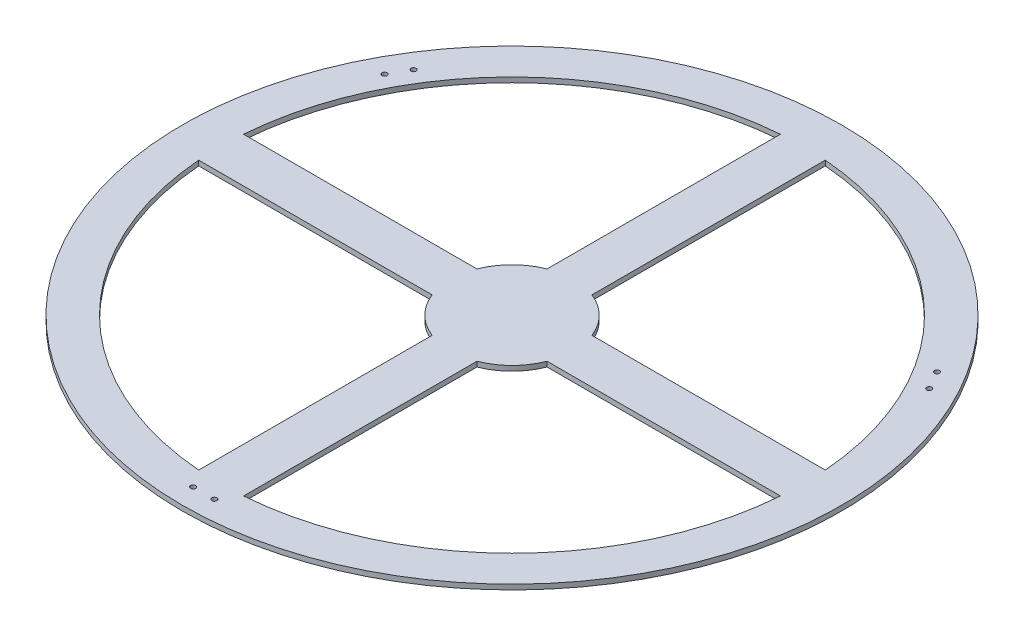
ISO-10303-21;
HEADER;
FILE_DESCRIPTION(('STEP AP214'),'2;1');
FILE_NAME('part.step','',(''),(''),'','','');
FILE_SCHEMA(('AUTOMOTIVE_DESIGN { 1 0 10303 214 1 1 1 1 }'));
ENDSEC;
DATA;
#1=APPLICATION_CONTEXT('core data for automotive mechanical design processes');
#2=APPLICATION_PROTOCOL_DEFINITION('international standard','automotive_design',2000,#1);
#3=PRODUCT_CONTEXT('',#1,'mechanical');
#4=PRODUCT('Part','Part','',(#3));
#5=PRODUCT_RELATED_PRODUCT_CATEGORY('part','',(#4));
#6=PRODUCT_DEFINITION_FORMATION('','',#4);
#7=PRODUCT_DEFINITION_CONTEXT('part definition',#1,'design');
#8=PRODUCT_DEFINITION('design','',#6,#7);
#9=PRODUCT_DEFINITION_SHAPE('','',#8);
#10=(LENGTH_UNIT() NAMED_UNIT(*) SI_UNIT(.MILLI.,.METRE.));
#11=(NAMED_UNIT(*) PLANE_ANGLE_UNIT() SI_UNIT($,.RADIAN.));
#12=(NAMED_UNIT(*) SI_UNIT($,.STERADIAN.) SOLID_ANGLE_UNIT());
#13=UNCERTAINTY_MEASURE_WITH_UNIT(LENGTH_MEASURE(1.E-05),#10,'distance_accuracy_value','');
#14=(GEOMETRIC_REPRESENTATION_CONTEXT(3) GLOBAL_UNCERTAINTY_ASSIGNED_CONTEXT((#13)) GLOBAL_UNIT_ASSIGNED_CONTEXT((#10,
#11,#12)) REPRESENTATION_CONTEXT('',''));
#15=CARTESIAN_POINT('',(0.,0.,0.));
#16=DIRECTION('',(0.,0.,1.));
#17=DIRECTION('',(1.,0.,0.));
#18=AXIS2_PLACEMENT_3D('',#15,#16,#17);
#19=CARTESIAN_POINT('',(479.721156758054,3.,-531.943650224748));
#20=DIRECTION('',(0.,1.,0.));
#21=DIRECTION('',(0.,0.,1.));
#22=AXIS2_PLACEMENT_3D('',#19,#20,#21);
#23=PLANE('',#22);
#24=CARTESIAN_POINT('',(642.374734864959,3.,-618.519388910717));
#25=DIRECTION('',(0.,1.,0.));
#26=DIRECTION('',(0.,0.,1.));
#27=AXIS2_PLACEMENT_3D('',#24,#25,#26);
#28=CIRCLE('',#27,1.50000000000008);
#29=CARTESIAN_POINT('',(642.374734864959,3.,-617.019388910717));
#30=VERTEX_POINT('',#29);
#31=EDGE_CURVE('E327',#30,#30,#28,.T.);
#32=ORIENTED_EDGE('',*,*,#31,.F.);
#33=EDGE_LOOP('',(#32));
#34=FACE_BOUND('',#33,.T.);
#35=DIRECTION('',(0.,0.,-1.));
#36=VECTOR('',#35,1.);
#37=CARTESIAN_POINT('',(466.318275115398,3.,-566.278317303318));
#38=LINE('',#37,#36);
#39=CARTESIAN_POINT('',(466.318275115398,3.,-566.278317303318));
#40=VERTEX_POINT('',#39);
#41=CARTESIAN_POINT('',(466.318275115398,3.,-705.664851299757));
#42=VERTEX_POINT('',#41);
#43=EDGE_CURVE('E160',#40,#42,#38,.T.);
#44=ORIENTED_EDGE('',*,*,#43,.F.);
#45=CARTESIAN_POINT('',(479.721156758054,3.,-531.943650224748));
#46=DIRECTION('',(0.,-1.,0.));
#47=DIRECTION('',(0.,0.,1.));
#48=AXIS2_PLACEMENT_3D('',#45,#46,#47);
#49=CIRCLE('',#48,36.8579245173041);
#50=CARTESIAN_POINT('',(445.386489679484,3.,-545.346531867404));
#51=VERTEX_POINT('',#50);
#52=EDGE_CURVE('E152',#51,#40,#49,.T.);
#53=ORIENTED_EDGE('',*,*,#52,.F.);
#54=DIRECTION('',(1.,0.,0.));
#55=VECTOR('',#54,1.);
#56=CARTESIAN_POINT('',(445.386489679484,3.,-545.346531867404));
#57=LINE('',#56,#55);
#58=CARTESIAN_POINT('',(305.999955683046,3.,-545.346531867404));
#59=VERTEX_POINT('',#58);
#60=EDGE_CURVE('E175',#59,#51,#57,.T.);
#61=ORIENTED_EDGE('',*,*,#60,.F.);
#62=CARTESIAN_POINT('',(479.721156758054,3.,-531.943650224748));
#63=DIRECTION('',(0.,1.,0.));
#64=DIRECTION('',(0.,0.,1.));
#65=AXIS2_PLACEMENT_3D('',#62,#63,#64);
#66=CIRCLE('',#65,174.237461354528);
#67=EDGE_CURVE('E173',#42,#59,#66,.T.);
#68=ORIENTED_EDGE('',*,*,#67,.F.);
#69=EDGE_LOOP('',(#44,#53,#61,#68));
#70=FACE_BOUND('',#69,.T.);
#71=DIRECTION('',(1.,0.,0.));
#72=VECTOR('',#71,1.);
#73=CARTESIAN_POINT('',(653.442357833063,3.,-545.346531867405));
#74=LINE('',#73,#72);
#75=CARTESIAN_POINT('',(514.055823836624,3.,-545.346531867405));
#76=VERTEX_POINT('',#75);
#77=CARTESIAN_POINT('',(653.442357833063,3.,-545.346531867405));
#78=VERTEX_POINT('',#77);
#79=EDGE_CURVE('E193',#76,#78,#74,.T.);
#80=ORIENTED_EDGE('',*,*,#79,.F.);
#81=CARTESIAN_POINT('',(479.721156758054,3.,-531.943650224748));
#82=DIRECTION('',(0.,-1.,0.));
#83=DIRECTION('',(0.,0.,1.));
#84=AXIS2_PLACEMENT_3D('',#81,#82,#83);
#85=CIRCLE('',#84,36.857924517304);
#86=CARTESIAN_POINT('',(493.12403840071,3.,-566.278317303318));
#87=VERTEX_POINT('',#86);
#88=EDGE_CURVE('E191',#87,#76,#85,.T.);
#89=ORIENTED_EDGE('',*,*,#88,.F.);
#90=DIRECTION('',(0.,0.,1.));
#91=VECTOR('',#90,1.);
#92=CARTESIAN_POINT('',(493.12403840071,3.,-566.278317303318));
#93=LINE('',#92,#91);
#94=CARTESIAN_POINT('',(493.12403840071,3.,-705.664851299757));
#95=VERTEX_POINT('',#94);
#96=EDGE_CURVE('E199',#95,#87,#93,.T.);
#97=ORIENTED_EDGE('',*,*,#96,.F.);
#98=CARTESIAN_POINT('',(479.721156758054,3.,-531.943650224748));
#99=DIRECTION('',(0.,1.,0.));
#100=DIRECTION('',(0.,0.,1.));
#101=AXIS2_PLACEMENT_3D('',#98,#99,#100);
#102=CIRCLE('',#101,174.237461354528);
#103=EDGE_CURVE('E196',#78,#95,#102,.T.);
#104=ORIENTED_EDGE('',*,*,#103,.F.);
#105=EDGE_LOOP('',(#80,#89,#97,#104));
#106=FACE_BOUND('',#105,.T.);
#107=CARTESIAN_POINT('',(323.41757865115,3.,-629.517911538779));
#108=DIRECTION('',(0.,1.,0.));
#109=DIRECTION('',(0.,0.,1.));
#110=AXIS2_PLACEMENT_3D('',#107,#108,#109);
#111=CIRCLE('',#110,1.50000000000008);
#112=CARTESIAN_POINT('',(323.41757865115,3.,-628.017911538779));
#113=VERTEX_POINT('',#112);
#114=EDGE_CURVE('E222',#113,#113,#111,.T.);
#115=ORIENTED_EDGE('',*,*,#114,.F.);
#116=EDGE_LOOP('',(#115));
#117=FACE_BOUND('',#116,.T.);
#118=CARTESIAN_POINT('',(473.371156758054,3.,-347.793650224748));
#119=DIRECTION('',(0.,1.,0.));
#120=DIRECTION('',(0.,0.,1.));
#121=AXIS2_PLACEMENT_3D('',#118,#119,#120);
#122=CIRCLE('',#121,1.50000000000002);
#123=CARTESIAN_POINT('',(473.371156758054,3.,-346.293650224748));
#124=VERTEX_POINT('',#123);
#125=EDGE_CURVE('E296',#124,#124,#122,.T.);
#126=ORIENTED_EDGE('',*,*,#125,.F.);
#127=EDGE_LOOP('',(#126));
#128=FACE_BOUND('',#127,.T.);
#129=CARTESIAN_POINT('',(479.721156758054,3.,-531.943650224748));
#130=DIRECTION('',(0.,1.,0.));
#131=DIRECTION('',(0.,0.,1.));
#132=AXIS2_PLACEMENT_3D('',#129,#130,#131);
#133=CIRCLE('',#132,196.85);
#134=CARTESIAN_POINT('',(479.721156758054,3.,-335.093650224748));
#135=VERTEX_POINT('',#134);
#136=EDGE_CURVE('E11',#135,#135,#133,.T.);
#137=ORIENTED_EDGE('',*,*,#136,.T.);
#138=EDGE_LOOP('',(#137));
#139=FACE_BOUND('',#138,.T.);
#140=CARTESIAN_POINT('',(486.071156758054,3.,-347.793650224748));
#141=DIRECTION('',(0.,1.,0.));
#142=DIRECTION('',(0.,0.,1.));
#143=AXIS2_PLACEMENT_3D('',#140,#141,#142);
#144=CIRCLE('',#143,1.50000000000002);
#145=CARTESIAN_POINT('',(486.071156758054,3.,-346.293650224748));
#146=VERTEX_POINT('',#145);
#147=EDGE_CURVE('E290',#146,#146,#144,.T.);
#148=ORIENTED_EDGE('',*,*,#147,.F.);
#149=EDGE_LOOP('',(#148));
#150=FACE_BOUND('',#149,.T.);
#151=DIRECTION('',(0.,0.,1.));
#152=VECTOR('',#151,1.);
#153=CARTESIAN_POINT('',(493.12403840071,3.,-358.22244914974));
#154=LINE('',#153,#152);
#155=CARTESIAN_POINT('',(493.12403840071,3.,-497.608983146178));
#156=VERTEX_POINT('',#155);
#157=CARTESIAN_POINT('',(493.12403840071,3.,-358.22244914974));
#158=VERTEX_POINT('',#157);
#159=EDGE_CURVE('E261',#156,#158,#154,.T.);
#160=ORIENTED_EDGE('',*,*,#159,.F.);
#161=CARTESIAN_POINT('',(479.721156758054,3.,-531.943650224748));
#162=DIRECTION('',(0.,-1.,0.));
#163=DIRECTION('',(0.,0.,1.));
#164=AXIS2_PLACEMENT_3D('',#161,#162,#163);
#165=CIRCLE('',#164,36.8579245173039);
#166=CARTESIAN_POINT('',(514.055823836624,3.,-518.540768582092));
#167=VERTEX_POINT('',#166);
#168=EDGE_CURVE('E259',#167,#156,#165,.T.);
#169=ORIENTED_EDGE('',*,*,#168,.F.);
#170=DIRECTION('',(-1.,0.,0.));
#171=VECTOR('',#170,1.);
#172=CARTESIAN_POINT('',(653.442357833063,3.,-518.540768582092));
#173=LINE('',#172,#171);
#174=CARTESIAN_POINT('',(653.442357833063,3.,-518.540768582092));
#175=VERTEX_POINT('',#174);
#176=EDGE_CURVE('E267',#175,#167,#173,.T.);
#177=ORIENTED_EDGE('',*,*,#176,.F.);
#178=CARTESIAN_POINT('',(479.721156758054,3.,-531.943650224748));
#179=DIRECTION('',(0.,1.,0.));
#180=DIRECTION('',(0.,0.,1.));
#181=AXIS2_PLACEMENT_3D('',#178,#179,#180);
#182=CIRCLE('',#181,174.237461354528);
#183=EDGE_CURVE('E264',#158,#175,#182,.T.);
#184=ORIENTED_EDGE('',*,*,#183,.F.);
#185=EDGE_LOOP('',(#160,#169,#177,#184));
#186=FACE_BOUND('',#185,.T.);
#187=DIRECTION('',(-1.,0.,0.));
#188=VECTOR('',#187,1.);
#189=CARTESIAN_POINT('',(305.999955683046,3.,-518.540768582092));
#190=LINE('',#189,#188);
#191=CARTESIAN_POINT('',(445.386489679484,3.,-518.540768582092));
#192=VERTEX_POINT('',#191);
#193=CARTESIAN_POINT('',(305.999955683046,3.,-518.540768582092));
#194=VERTEX_POINT('',#193);
#195=EDGE_CURVE('E230',#192,#194,#190,.T.);
#196=ORIENTED_EDGE('',*,*,#195,.F.);
#197=CARTESIAN_POINT('',(479.721156758054,3.,-531.943650224748));
#198=DIRECTION('',(0.,-1.,0.));
#199=DIRECTION('',(0.,0.,1.));
#200=AXIS2_PLACEMENT_3D('',#197,#198,#199);
#201=CIRCLE('',#200,36.857924517304);
#202=CARTESIAN_POINT('',(466.318275115398,3.,-497.608983146178));
#203=VERTEX_POINT('',#202);
#204=EDGE_CURVE('E228',#203,#192,#201,.T.);
#205=ORIENTED_EDGE('',*,*,#204,.F.);
#206=DIRECTION('',(0.,0.,-1.));
#207=VECTOR('',#206,1.);
#208=CARTESIAN_POINT('',(466.318275115398,3.,-358.22244914974));
#209=LINE('',#208,#207);
#210=CARTESIAN_POINT('',(466.318275115398,3.,-358.22244914974));
#211=VERTEX_POINT('',#210);
#212=EDGE_CURVE('E236',#211,#203,#209,.T.);
#213=ORIENTED_EDGE('',*,*,#212,.F.);
#214=CARTESIAN_POINT('',(479.721156758054,3.,-531.943650224748));
#215=DIRECTION('',(0.,1.,0.));
#216=DIRECTION('',(0.,0.,1.));
#217=AXIS2_PLACEMENT_3D('',#214,#215,#216);
#218=CIRCLE('',#217,174.237461354528);
#219=EDGE_CURVE('E233',#194,#211,#218,.T.);
#220=ORIENTED_EDGE('',*,*,#219,.F.);
#221=EDGE_LOOP('',(#196,#205,#213,#220));
#222=FACE_BOUND('',#221,.T.);
#223=CARTESIAN_POINT('',(317.06757865115,3.,-618.519388910717));
#224=DIRECTION('',(0.,1.,0.));
#225=DIRECTION('',(0.,0.,1.));
#226=AXIS2_PLACEMENT_3D('',#223,#224,#225);
#227=CIRCLE('',#226,1.50000000000008);
#228=CARTESIAN_POINT('',(317.06757865115,3.,-617.019388910717));
#229=VERTEX_POINT('',#228);
#230=EDGE_CURVE('E181',#229,#229,#227,.T.);
#231=ORIENTED_EDGE('',*,*,#230,.F.);
#232=EDGE_LOOP('',(#231));
#233=FACE_BOUND('',#232,.T.);
#234=CARTESIAN_POINT('',(636.024734864959,3.,-629.51791153878));
#235=DIRECTION('',(0.,1.,0.));
#236=DIRECTION('',(0.,0.,1.));
#237=AXIS2_PLACEMENT_3D('',#234,#235,#236);
#238=CIRCLE('',#237,1.50000000000008);
#239=CARTESIAN_POINT('',(636.024734864959,3.,-628.017911538779));
#240=VERTEX_POINT('',#239);
#241=EDGE_CURVE('E334',#240,#240,#238,.T.);
#242=ORIENTED_EDGE('',*,*,#241,.F.);
#243=EDGE_LOOP('',(#242));
#244=FACE_BOUND('',#243,.T.);
#245=ADVANCED_FACE('F39',(#34,#70,#106,#117,#128,#139,#150,#186,#222,#233,#244),#23,.T.);
#246=CARTESIAN_POINT('',(479.721156758054,0.,-531.943650224748));
#247=DIRECTION('',(0.,1.,0.));
#248=DIRECTION('',(0.,0.,1.));
#249=AXIS2_PLACEMENT_3D('',#246,#247,#248);
#250=PLANE('',#249);
#251=CARTESIAN_POINT('',(479.721156758054,0.,-531.943650224748));
#252=DIRECTION('',(0.,-1.,0.));
#253=DIRECTION('',(0.,0.,1.));
#254=AXIS2_PLACEMENT_3D('',#251,#252,#253);
#255=CIRCLE('',#254,36.857924517304);
#256=CARTESIAN_POINT('',(493.12403840071,0.,-566.278317303318));
#257=VERTEX_POINT('',#256);
#258=CARTESIAN_POINT('',(514.055823836624,0.,-545.346531867405));
#259=VERTEX_POINT('',#258);
#260=EDGE_CURVE('E168',#257,#259,#255,.T.);
#261=ORIENTED_EDGE('',*,*,#260,.T.);
#262=DIRECTION('',(1.,0.,0.));
#263=VECTOR('',#262,1.);
#264=CARTESIAN_POINT('',(653.442357833063,0.,-545.346531867405));
#265=LINE('',#264,#263);
#266=CARTESIAN_POINT('',(653.442357833063,0.,-545.346531867405));
#267=VERTEX_POINT('',#266);
#268=EDGE_CURVE('E204',#259,#267,#265,.T.);
#269=ORIENTED_EDGE('',*,*,#268,.T.);
#270=CARTESIAN_POINT('',(479.721156758054,0.,-531.943650224748));
#271=DIRECTION('',(0.,1.,0.));
#272=DIRECTION('',(0.,0.,1.));
#273=AXIS2_PLACEMENT_3D('',#270,#271,#272);
#274=CIRCLE('',#273,174.237461354528);
#275=CARTESIAN_POINT('',(493.12403840071,0.,-705.664851299757));
#276=VERTEX_POINT('',#275);
#277=EDGE_CURVE('E207',#267,#276,#274,.T.);
#278=ORIENTED_EDGE('',*,*,#277,.T.);
#279=DIRECTION('',(0.,0.,1.));
#280=VECTOR('',#279,1.);
#281=CARTESIAN_POINT('',(493.12403840071,0.,-566.278317303318));
#282=LINE('',#281,#280);
#283=EDGE_CURVE('E194',#276,#257,#282,.T.);
#284=ORIENTED_EDGE('',*,*,#283,.T.);
#285=EDGE_LOOP('',(#261,#269,#278,#284));
#286=FACE_BOUND('',#285,.T.);
#287=CARTESIAN_POINT('',(479.721156758054,0.,-531.943650224748));
#288=DIRECTION('',(0.,-1.,0.));
#289=DIRECTION('',(0.,0.,1.));
#290=AXIS2_PLACEMENT_3D('',#287,#288,#289);
#291=CIRCLE('',#290,36.8579245173039);
#292=CARTESIAN_POINT('',(514.055823836624,0.,-518.540768582093));
#293=VERTEX_POINT('',#292);
#294=CARTESIAN_POINT('',(493.12403840071,0.,-497.608983146178));
#295=VERTEX_POINT('',#294);
#296=EDGE_CURVE('E258',#293,#295,#291,.T.);
#297=ORIENTED_EDGE('',*,*,#296,.T.);
#298=DIRECTION('',(0.,0.,1.));
#299=VECTOR('',#298,1.);
#300=CARTESIAN_POINT('',(493.12403840071,0.,-358.22244914974));
#301=LINE('',#300,#299);
#302=CARTESIAN_POINT('',(493.12403840071,0.,-358.22244914974));
#303=VERTEX_POINT('',#302);
#304=EDGE_CURVE('E272',#295,#303,#301,.T.);
#305=ORIENTED_EDGE('',*,*,#304,.T.);
#306=CARTESIAN_POINT('',(479.721156758054,0.,-531.943650224748));
#307=DIRECTION('',(0.,1.,0.));
#308=DIRECTION('',(0.,0.,1.));
#309=AXIS2_PLACEMENT_3D('',#306,#307,#308);
#310=CIRCLE('',#309,174.237461354528);
#311=CARTESIAN_POINT('',(653.442357833063,0.,-518.540768582092));
#312=VERTEX_POINT('',#311);
#313=EDGE_CURVE('E275',#303,#312,#310,.T.);
#314=ORIENTED_EDGE('',*,*,#313,.T.);
#315=DIRECTION('',(-1.,0.,0.));
#316=VECTOR('',#315,1.);
#317=CARTESIAN_POINT('',(653.442357833063,0.,-518.540768582092));
#318=LINE('',#317,#316);
#319=EDGE_CURVE('E262',#312,#293,#318,.T.);
#320=ORIENTED_EDGE('',*,*,#319,.T.);
#321=EDGE_LOOP('',(#297,#305,#314,#320));
#322=FACE_BOUND('',#321,.T.);
#323=CARTESIAN_POINT('',(479.721156758054,0.,-531.943650224748));
#324=DIRECTION('',(0.,1.,0.));
#325=DIRECTION('',(0.,0.,1.));
#326=AXIS2_PLACEMENT_3D('',#323,#324,#325);
#327=CIRCLE('',#326,196.85);
#328=CARTESIAN_POINT('',(479.721156758054,0.,-335.093650224748));
#329=VERTEX_POINT('',#328);
#330=EDGE_CURVE('E43',#329,#329,#327,.T.);
#331=ORIENTED_EDGE('',*,*,#330,.F.);
#332=EDGE_LOOP('',(#331));
#333=FACE_BOUND('',#332,.T.);
#334=CARTESIAN_POINT('',(473.371156758054,0.,-347.793650224748));
#335=DIRECTION('',(0.,1.,0.));
#336=DIRECTION('',(0.,0.,1.));
#337=AXIS2_PLACEMENT_3D('',#334,#335,#336);
#338=CIRCLE('',#337,1.50000000000002);
#339=CARTESIAN_POINT('',(473.371156758054,0.,-346.293650224748));
#340=VERTEX_POINT('',#339);
#341=EDGE_CURVE('E293',#340,#340,#338,.T.);
#342=ORIENTED_EDGE('',*,*,#341,.T.);
#343=EDGE_LOOP('',(#342));
#344=FACE_BOUND('',#343,.T.);
#345=CARTESIAN_POINT('',(486.071156758054,0.,-347.793650224748));
#346=DIRECTION('',(0.,1.,0.));
#347=DIRECTION('',(0.,0.,1.));
#348=AXIS2_PLACEMENT_3D('',#345,#346,#347);
#349=CIRCLE('',#348,1.50000000000002);
#350=CARTESIAN_POINT('',(486.071156758054,0.,-346.293650224748));
#351=VERTEX_POINT('',#350);
#352=EDGE_CURVE('E289',#351,#351,#349,.T.);
#353=ORIENTED_EDGE('',*,*,#352,.T.);
#354=EDGE_LOOP('',(#353));
#355=FACE_BOUND('',#354,.T.);
#356=CARTESIAN_POINT('',(479.721156758054,0.,-531.943650224748));
#357=DIRECTION('',(0.,-1.,0.));
#358=DIRECTION('',(0.,0.,1.));
#359=AXIS2_PLACEMENT_3D('',#356,#357,#358);
#360=CIRCLE('',#359,36.857924517304);
#361=CARTESIAN_POINT('',(466.318275115398,0.,-497.608983146178));
#362=VERTEX_POINT('',#361);
#363=CARTESIAN_POINT('',(445.386489679484,0.,-518.540768582092));
#364=VERTEX_POINT('',#363);
#365=EDGE_CURVE('E225',#362,#364,#360,.T.);
#366=ORIENTED_EDGE('',*,*,#365,.T.);
#367=DIRECTION('',(-1.,0.,0.));
#368=VECTOR('',#367,1.);
#369=CARTESIAN_POINT('',(305.999955683046,0.,-518.540768582092));
#370=LINE('',#369,#368);
#371=CARTESIAN_POINT('',(305.999955683046,0.,-518.540768582092));
#372=VERTEX_POINT('',#371);
#373=EDGE_CURVE('E241',#364,#372,#370,.T.);
#374=ORIENTED_EDGE('',*,*,#373,.T.);
#375=CARTESIAN_POINT('',(479.721156758054,0.,-531.943650224748));
#376=DIRECTION('',(0.,1.,0.));
#377=DIRECTION('',(0.,0.,1.));
#378=AXIS2_PLACEMENT_3D('',#375,#376,#377);
#379=CIRCLE('',#378,174.237461354528);
#380=CARTESIAN_POINT('',(466.318275115398,0.,-358.22244914974));
#381=VERTEX_POINT('',#380);
#382=EDGE_CURVE('E244',#372,#381,#379,.T.);
#383=ORIENTED_EDGE('',*,*,#382,.T.);
#384=DIRECTION('',(0.,0.,-1.));
#385=VECTOR('',#384,1.);
#386=CARTESIAN_POINT('',(466.318275115398,0.,-358.22244914974));
#387=LINE('',#386,#385);
#388=EDGE_CURVE('E231',#381,#362,#387,.T.);
#389=ORIENTED_EDGE('',*,*,#388,.T.);
#390=EDGE_LOOP('',(#366,#374,#383,#389));
#391=FACE_BOUND('',#390,.T.);
#392=CARTESIAN_POINT('',(323.41757865115,0.,-629.517911538779));
#393=DIRECTION('',(0.,1.,0.));
#394=DIRECTION('',(0.,0.,1.));
#395=AXIS2_PLACEMENT_3D('',#392,#393,#394);
#396=CIRCLE('',#395,1.50000000000008);
#397=CARTESIAN_POINT('',(323.41757865115,0.,-628.017911538779));
#398=VERTEX_POINT('',#397);
#399=EDGE_CURVE('E221',#398,#398,#396,.T.);
#400=ORIENTED_EDGE('',*,*,#399,.T.);
#401=EDGE_LOOP('',(#400));
#402=FACE_BOUND('',#401,.T.);
#403=CARTESIAN_POINT('',(479.721156758054,0.,-531.943650224748));
#404=DIRECTION('',(0.,-1.,0.));
#405=DIRECTION('',(0.,0.,1.));
#406=AXIS2_PLACEMENT_3D('',#403,#404,#405);
#407=CIRCLE('',#406,36.8579245173041);
#408=CARTESIAN_POINT('',(445.386489679484,0.,-545.346531867404));
#409=VERTEX_POINT('',#408);
#410=CARTESIAN_POINT('',(466.318275115398,0.,-566.278317303318));
#411=VERTEX_POINT('',#410);
#412=EDGE_CURVE('E62',#409,#411,#407,.T.);
#413=ORIENTED_EDGE('',*,*,#412,.T.);
#414=DIRECTION('',(0.,0.,-1.));
#415=VECTOR('',#414,1.);
#416=CARTESIAN_POINT('',(466.318275115398,0.,-566.278317303318));
#417=LINE('',#416,#415);
#418=CARTESIAN_POINT('',(466.318275115398,0.,-705.664851299757));
#419=VERTEX_POINT('',#418);
#420=EDGE_CURVE('E167',#411,#419,#417,.T.);
#421=ORIENTED_EDGE('',*,*,#420,.T.);
#422=CARTESIAN_POINT('',(479.721156758054,0.,-531.943650224748));
#423=DIRECTION('',(0.,1.,0.));
#424=DIRECTION('',(0.,0.,1.));
#425=AXIS2_PLACEMENT_3D('',#422,#423,#424);
#426=CIRCLE('',#425,174.237461354528);
#427=CARTESIAN_POINT('',(305.999955683046,0.,-545.346531867404));
#428=VERTEX_POINT('',#427);
#429=EDGE_CURVE('E183',#419,#428,#426,.T.);
#430=ORIENTED_EDGE('',*,*,#429,.T.);
#431=DIRECTION('',(1.,0.,0.));
#432=VECTOR('',#431,1.);
#433=CARTESIAN_POINT('',(445.386489679484,0.,-545.346531867404));
#434=LINE('',#433,#432);
#435=EDGE_CURVE('E161',#428,#409,#434,.T.);
#436=ORIENTED_EDGE('',*,*,#435,.T.);
#437=EDGE_LOOP('',(#413,#421,#430,#436));
#438=FACE_BOUND('',#437,.T.);
#439=CARTESIAN_POINT('',(317.06757865115,0.,-618.519388910717));
#440=DIRECTION('',(0.,1.,0.));
#441=DIRECTION('',(0.,0.,1.));
#442=AXIS2_PLACEMENT_3D('',#439,#440,#441);
#443=CIRCLE('',#442,1.50000000000008);
#444=CARTESIAN_POINT('',(317.06757865115,0.,-617.019388910717));
#445=VERTEX_POINT('',#444);
#446=EDGE_CURVE('E329',#445,#445,#443,.T.);
#447=ORIENTED_EDGE('',*,*,#446,.T.);
#448=EDGE_LOOP('',(#447));
#449=FACE_BOUND('',#448,.T.);
#450=CARTESIAN_POINT('',(642.374734864959,0.,-618.519388910717));
#451=DIRECTION('',(0.,1.,0.));
#452=DIRECTION('',(0.,0.,1.));
#453=AXIS2_PLACEMENT_3D('',#450,#451,#452);
#454=CIRCLE('',#453,1.50000000000008);
#455=CARTESIAN_POINT('',(642.374734864959,0.,-617.019388910717));
#456=VERTEX_POINT('',#455);
#457=EDGE_CURVE('E330',#456,#456,#454,.T.);
#458=ORIENTED_EDGE('',*,*,#457,.T.);
#459=EDGE_LOOP('',(#458));
#460=FACE_BOUND('',#459,.T.);
#461=CARTESIAN_POINT('',(636.024734864959,0.,-629.51791153878));
#462=DIRECTION('',(0.,1.,0.));
#463=DIRECTION('',(0.,0.,1.));
#464=AXIS2_PLACEMENT_3D('',#461,#462,#463);
#465=CIRCLE('',#464,1.50000000000008);
#466=CARTESIAN_POINT('',(636.024734864959,0.,-628.017911538779));
#467=VERTEX_POINT('',#466);
#468=EDGE_CURVE('E337',#467,#467,#465,.T.);
#469=ORIENTED_EDGE('',*,*,#468,.T.);
#470=EDGE_LOOP('',(#469));
#471=FACE_BOUND('',#470,.T.);
#472=ADVANCED_FACE('F302',(#286,#322,#333,#344,#355,#391,#402,#438,#449,#460,#471),#250,.F.);
#473=CARTESIAN_POINT('',(479.721156758054,3.,-531.943650224748));
#474=DIRECTION('',(0.,-1.,0.));
#475=DIRECTION('',(0.,0.,-1.));
#476=AXIS2_PLACEMENT_3D('',#473,#474,#475);
#477=CYLINDRICAL_SURFACE('',#476,196.85);
#478=ORIENTED_EDGE('',*,*,#136,.F.);
#479=EDGE_LOOP('',(#478));
#480=FACE_BOUND('',#479,.T.);
#481=ORIENTED_EDGE('',*,*,#330,.T.);
#482=EDGE_LOOP('',(#481));
#483=FACE_BOUND('',#482,.T.);
#484=ADVANCED_FACE('F41',(#480,#483),#477,.T.);
#485=CARTESIAN_POINT('',(473.371156758054,3.,-347.793650224748));
#486=DIRECTION('',(0.,-1.,0.));
#487=DIRECTION('',(0.,0.,-1.));
#488=AXIS2_PLACEMENT_3D('',#485,#486,#487);
#489=CYLINDRICAL_SURFACE('',#488,1.50000000000002);
#490=ORIENTED_EDGE('',*,*,#125,.T.);
#491=EDGE_LOOP('',(#490));
#492=FACE_BOUND('',#491,.T.);
#493=ORIENTED_EDGE('',*,*,#341,.F.);
#494=EDGE_LOOP('',(#493));
#495=FACE_BOUND('',#494,.T.);
#496=ADVANCED_FACE('F305',(#492,#495),#489,.F.);
#497=CARTESIAN_POINT('',(486.071156758054,3.,-347.793650224748));
#498=DIRECTION('',(0.,-1.,0.));
#499=DIRECTION('',(0.,0.,-1.));
#500=AXIS2_PLACEMENT_3D('',#497,#498,#499);
#501=CYLINDRICAL_SURFACE('',#500,1.50000000000002);
#502=ORIENTED_EDGE('',*,*,#147,.T.);
#503=EDGE_LOOP('',(#502));
#504=FACE_BOUND('',#503,.T.);
#505=ORIENTED_EDGE('',*,*,#352,.F.);
#506=EDGE_LOOP('',(#505));
#507=FACE_BOUND('',#506,.T.);
#508=ADVANCED_FACE('F307',(#504,#507),#501,.F.);
#509=CARTESIAN_POINT('',(479.721156758054,3.,-531.943650224748));
#510=DIRECTION('',(0.,-1.,0.));
#511=DIRECTION('',(0.,0.,-1.));
#512=AXIS2_PLACEMENT_3D('',#509,#510,#511);
#513=CYLINDRICAL_SURFACE('',#512,36.8579245173039);
#514=ORIENTED_EDGE('',*,*,#296,.F.);
#515=DIRECTION('',(0.,-1.,0.));
#516=VECTOR('',#515,1.);
#517=CARTESIAN_POINT('',(514.055823836624,3.,-518.540768582092));
#518=LINE('',#517,#516);
#519=EDGE_CURVE('E269',#167,#293,#518,.T.);
#520=ORIENTED_EDGE('',*,*,#519,.F.);
#521=ORIENTED_EDGE('',*,*,#168,.T.);
#522=DIRECTION('',(0.,-1.,0.));
#523=VECTOR('',#522,1.);
#524=CARTESIAN_POINT('',(493.12403840071,3.,-497.608983146178));
#525=LINE('',#524,#523);
#526=EDGE_CURVE('E286',#156,#295,#525,.T.);
#527=ORIENTED_EDGE('',*,*,#526,.T.);
#528=EDGE_LOOP('',(#514,#520,#521,#527));
#529=FACE_BOUND('',#528,.T.);
#530=ADVANCED_FACE('F314',(#529),#513,.T.);
#531=CARTESIAN_POINT('',(493.12403840071,3.,-358.22244914974));
#532=DIRECTION('',(1.,0.,0.));
#533=DIRECTION('',(0.,0.,-1.));
#534=AXIS2_PLACEMENT_3D('',#531,#532,#533);
#535=PLANE('',#534);
#536=ORIENTED_EDGE('',*,*,#304,.F.);
#537=ORIENTED_EDGE('',*,*,#526,.F.);
#538=ORIENTED_EDGE('',*,*,#159,.T.);
#539=DIRECTION('',(0.,-1.,0.));
#540=VECTOR('',#539,1.);
#541=CARTESIAN_POINT('',(493.12403840071,3.,-358.22244914974));
#542=LINE('',#541,#540);
#543=EDGE_CURVE('E284',#158,#303,#542,.T.);
#544=ORIENTED_EDGE('',*,*,#543,.T.);
#545=EDGE_LOOP('',(#536,#537,#538,#544));
#546=FACE_BOUND('',#545,.T.);
#547=ADVANCED_FACE('F419',(#546),#535,.T.);
#548=CARTESIAN_POINT('',(479.721156758054,3.,-531.943650224748));
#549=DIRECTION('',(0.,-1.,0.));
#550=DIRECTION('',(0.,0.,-1.));
#551=AXIS2_PLACEMENT_3D('',#548,#549,#550);
#552=CYLINDRICAL_SURFACE('',#551,174.237461354528);
#553=ORIENTED_EDGE('',*,*,#313,.F.);
#554=ORIENTED_EDGE('',*,*,#543,.F.);
#555=ORIENTED_EDGE('',*,*,#183,.T.);
#556=DIRECTION('',(0.,-1.,0.));
#557=VECTOR('',#556,1.);
#558=CARTESIAN_POINT('',(653.442357833063,3.,-518.540768582092));
#559=LINE('',#558,#557);
#560=EDGE_CURVE('E282',#175,#312,#559,.T.);
#561=ORIENTED_EDGE('',*,*,#560,.T.);
#562=EDGE_LOOP('',(#553,#554,#555,#561));
#563=FACE_BOUND('',#562,.T.);
#564=ADVANCED_FACE('F415',(#563),#552,.F.);
#565=CARTESIAN_POINT('',(653.442357833063,3.,-518.540768582092));
#566=DIRECTION('',(0.,0.,1.));
#567=DIRECTION('',(1.,0.,0.));
#568=AXIS2_PLACEMENT_3D('',#565,#566,#567);
#569=PLANE('',#568);
#570=ORIENTED_EDGE('',*,*,#319,.F.);
#571=ORIENTED_EDGE('',*,*,#560,.F.);
#572=ORIENTED_EDGE('',*,*,#176,.T.);
#573=ORIENTED_EDGE('',*,*,#519,.T.);
#574=EDGE_LOOP('',(#570,#571,#572,#573));
#575=FACE_BOUND('',#574,.T.);
#576=ADVANCED_FACE('F411',(#575),#569,.T.);
#577=CARTESIAN_POINT('',(479.721156758054,3.,-531.943650224748));
#578=DIRECTION('',(0.,-1.,0.));
#579=DIRECTION('',(0.,0.,-1.));
#580=AXIS2_PLACEMENT_3D('',#577,#578,#579);
#581=CYLINDRICAL_SURFACE('',#580,36.857924517304);
#582=ORIENTED_EDGE('',*,*,#365,.F.);
#583=DIRECTION('',(0.,-1.,0.));
#584=VECTOR('',#583,1.);
#585=CARTESIAN_POINT('',(466.318275115398,3.,-497.608983146178));
#586=LINE('',#585,#584);
#587=EDGE_CURVE('E238',#203,#362,#586,.T.);
#588=ORIENTED_EDGE('',*,*,#587,.F.);
#589=ORIENTED_EDGE('',*,*,#204,.T.);
#590=DIRECTION('',(0.,-1.,0.));
#591=VECTOR('',#590,1.);
#592=CARTESIAN_POINT('',(445.386489679484,3.,-518.540768582092));
#593=LINE('',#592,#591);
#594=EDGE_CURVE('E255',#192,#364,#593,.T.);
#595=ORIENTED_EDGE('',*,*,#594,.T.);
#596=EDGE_LOOP('',(#582,#588,#589,#595));
#597=FACE_BOUND('',#596,.T.);
#598=ADVANCED_FACE('F407',(#597),#581,.T.);
#599=CARTESIAN_POINT('',(305.999955683046,3.,-518.540768582092));
#600=DIRECTION('',(0.,0.,1.));
#601=DIRECTION('',(1.,0.,0.));
#602=AXIS2_PLACEMENT_3D('',#599,#600,#601);
#603=PLANE('',#602);
#604=ORIENTED_EDGE('',*,*,#373,.F.);
#605=ORIENTED_EDGE('',*,*,#594,.F.);
#606=ORIENTED_EDGE('',*,*,#195,.T.);
#607=DIRECTION('',(0.,-1.,0.));
#608=VECTOR('',#607,1.);
#609=CARTESIAN_POINT('',(305.999955683046,3.,-518.540768582092));
#610=LINE('',#609,#608);
#611=EDGE_CURVE('E253',#194,#372,#610,.T.);
#612=ORIENTED_EDGE('',*,*,#611,.T.);
#613=EDGE_LOOP('',(#604,#605,#606,#612));
#614=FACE_BOUND('',#613,.T.);
#615=ADVANCED_FACE('F403',(#614),#603,.T.);
#616=CARTESIAN_POINT('',(479.721156758054,3.,-531.943650224748));
#617=DIRECTION('',(0.,-1.,0.));
#618=DIRECTION('',(0.,0.,-1.));
#619=AXIS2_PLACEMENT_3D('',#616,#617,#618);
#620=CYLINDRICAL_SURFACE('',#619,174.237461354528);
#621=ORIENTED_EDGE('',*,*,#382,.F.);
#622=ORIENTED_EDGE('',*,*,#611,.F.);
#623=ORIENTED_EDGE('',*,*,#219,.T.);
#624=DIRECTION('',(0.,-1.,0.));
#625=VECTOR('',#624,1.);
#626=CARTESIAN_POINT('',(466.318275115398,3.,-358.22244914974));
#627=LINE('',#626,#625);
#628=EDGE_CURVE('E251',#211,#381,#627,.T.);
#629=ORIENTED_EDGE('',*,*,#628,.T.);
#630=EDGE_LOOP('',(#621,#622,#623,#629));
#631=FACE_BOUND('',#630,.T.);
#632=ADVANCED_FACE('F399',(#631),#620,.F.);
#633=CARTESIAN_POINT('',(466.318275115398,3.,-358.22244914974));
#634=DIRECTION('',(-1.,0.,0.));
#635=DIRECTION('',(0.,0.,1.));
#636=AXIS2_PLACEMENT_3D('',#633,#634,#635);
#637=PLANE('',#636);
#638=ORIENTED_EDGE('',*,*,#388,.F.);
#639=ORIENTED_EDGE('',*,*,#628,.F.);
#640=ORIENTED_EDGE('',*,*,#212,.T.);
#641=ORIENTED_EDGE('',*,*,#587,.T.);
#642=EDGE_LOOP('',(#638,#639,#640,#641));
#643=FACE_BOUND('',#642,.T.);
#644=ADVANCED_FACE('F395',(#643),#637,.T.);
#645=CARTESIAN_POINT('',(323.41757865115,3.,-629.517911538779));
#646=DIRECTION('',(0.,-1.,0.));
#647=DIRECTION('',(0.,0.,-1.));
#648=AXIS2_PLACEMENT_3D('',#645,#646,#647);
#649=CYLINDRICAL_SURFACE('',#648,1.50000000000008);
#650=ORIENTED_EDGE('',*,*,#114,.T.);
#651=EDGE_LOOP('',(#650));
#652=FACE_BOUND('',#651,.T.);
#653=ORIENTED_EDGE('',*,*,#399,.F.);
#654=EDGE_LOOP('',(#653));
#655=FACE_BOUND('',#654,.T.);
#656=ADVANCED_FACE('F391',(#652,#655),#649,.F.);
#657=CARTESIAN_POINT('',(479.721156758054,3.,-531.943650224748));
#658=DIRECTION('',(0.,-1.,0.));
#659=DIRECTION('',(0.,0.,-1.));
#660=AXIS2_PLACEMENT_3D('',#657,#658,#659);
#661=CYLINDRICAL_SURFACE('',#660,36.857924517304);
#662=ORIENTED_EDGE('',*,*,#260,.F.);
#663=DIRECTION('',(0.,-1.,0.));
#664=VECTOR('',#663,1.);
#665=CARTESIAN_POINT('',(493.12403840071,3.,-566.278317303318));
#666=LINE('',#665,#664);
#667=EDGE_CURVE('E201',#87,#257,#666,.T.);
#668=ORIENTED_EDGE('',*,*,#667,.F.);
#669=ORIENTED_EDGE('',*,*,#88,.T.);
#670=DIRECTION('',(0.,-1.,0.));
#671=VECTOR('',#670,1.);
#672=CARTESIAN_POINT('',(514.055823836624,3.,-545.346531867405));
#673=LINE('',#672,#671);
#674=EDGE_CURVE('E218',#76,#259,#673,.T.);
#675=ORIENTED_EDGE('',*,*,#674,.T.);
#676=EDGE_LOOP('',(#662,#668,#669,#675));
#677=FACE_BOUND('',#676,.T.);
#678=ADVANCED_FACE('F387',(#677),#661,.T.);
#679=CARTESIAN_POINT('',(653.442357833063,3.,-545.346531867405));
#680=DIRECTION('',(0.,0.,-1.));
#681=DIRECTION('',(-1.,0.,0.));
#682=AXIS2_PLACEMENT_3D('',#679,#680,#681);
#683=PLANE('',#682);
#684=ORIENTED_EDGE('',*,*,#268,.F.);
#685=ORIENTED_EDGE('',*,*,#674,.F.);
#686=ORIENTED_EDGE('',*,*,#79,.T.);
#687=DIRECTION('',(0.,-1.,0.));
#688=VECTOR('',#687,1.);
#689=CARTESIAN_POINT('',(653.442357833063,3.,-545.346531867405));
#690=LINE('',#689,#688);
#691=EDGE_CURVE('E216',#78,#267,#690,.T.);
#692=ORIENTED_EDGE('',*,*,#691,.T.);
#693=EDGE_LOOP('',(#684,#685,#686,#692));
#694=FACE_BOUND('',#693,.T.);
#695=ADVANCED_FACE('F383',(#694),#683,.T.);
#696=CARTESIAN_POINT('',(479.721156758054,3.,-531.943650224748));
#697=DIRECTION('',(0.,-1.,0.));
#698=DIRECTION('',(0.,0.,-1.));
#699=AXIS2_PLACEMENT_3D('',#696,#697,#698);
#700=CYLINDRICAL_SURFACE('',#699,174.237461354528);
#701=ORIENTED_EDGE('',*,*,#277,.F.);
#702=ORIENTED_EDGE('',*,*,#691,.F.);
#703=ORIENTED_EDGE('',*,*,#103,.T.);
#704=DIRECTION('',(0.,-1.,0.));
#705=VECTOR('',#704,1.);
#706=CARTESIAN_POINT('',(493.12403840071,3.,-705.664851299757));
#707=LINE('',#706,#705);
#708=EDGE_CURVE('E214',#95,#276,#707,.T.);
#709=ORIENTED_EDGE('',*,*,#708,.T.);
#710=EDGE_LOOP('',(#701,#702,#703,#709));
#711=FACE_BOUND('',#710,.T.);
#712=ADVANCED_FACE('F379',(#711),#700,.F.);
#713=CARTESIAN_POINT('',(493.12403840071,3.,-566.278317303318));
#714=DIRECTION('',(1.,0.,0.));
#715=DIRECTION('',(0.,0.,-1.));
#716=AXIS2_PLACEMENT_3D('',#713,#714,#715);
#717=PLANE('',#716);
#718=ORIENTED_EDGE('',*,*,#283,.F.);
#719=ORIENTED_EDGE('',*,*,#708,.F.);
#720=ORIENTED_EDGE('',*,*,#96,.T.);
#721=ORIENTED_EDGE('',*,*,#667,.T.);
#722=EDGE_LOOP('',(#718,#719,#720,#721));
#723=FACE_BOUND('',#722,.T.);
#724=ADVANCED_FACE('F376',(#723),#717,.T.);
#725=CARTESIAN_POINT('',(479.721156758054,3.,-531.943650224748));
#726=DIRECTION('',(0.,-1.,0.));
#727=DIRECTION('',(0.,0.,-1.));
#728=AXIS2_PLACEMENT_3D('',#725,#726,#727);
#729=CYLINDRICAL_SURFACE('',#728,36.8579245173041);
#730=ORIENTED_EDGE('',*,*,#412,.F.);
#731=DIRECTION('',(0.,-1.,0.));
#732=VECTOR('',#731,1.);
#733=CARTESIAN_POINT('',(445.386489679484,3.,-545.346531867404));
#734=LINE('',#733,#732);
#735=EDGE_CURVE('E156',#51,#409,#734,.T.);
#736=ORIENTED_EDGE('',*,*,#735,.F.);
#737=ORIENTED_EDGE('',*,*,#52,.T.);
#738=DIRECTION('',(0.,-1.,0.));
#739=VECTOR('',#738,1.);
#740=CARTESIAN_POINT('',(466.318275115398,3.,-566.278317303318));
#741=LINE('',#740,#739);
#742=EDGE_CURVE('E155',#40,#411,#741,.T.);
#743=ORIENTED_EDGE('',*,*,#742,.T.);
#744=EDGE_LOOP('',(#730,#736,#737,#743));
#745=FACE_BOUND('',#744,.T.);
#746=ADVANCED_FACE('F154',(#745),#729,.T.);
#747=CARTESIAN_POINT('',(466.318275115398,3.,-566.278317303318));
#748=DIRECTION('',(-1.,0.,0.));
#749=DIRECTION('',(0.,0.,1.));
#750=AXIS2_PLACEMENT_3D('',#747,#748,#749);
#751=PLANE('',#750);
#752=ORIENTED_EDGE('',*,*,#420,.F.);
#753=ORIENTED_EDGE('',*,*,#742,.F.);
#754=ORIENTED_EDGE('',*,*,#43,.T.);
#755=DIRECTION('',(0.,-1.,0.));
#756=VECTOR('',#755,1.);
#757=CARTESIAN_POINT('',(466.318275115398,3.,-705.664851299757));
#758=LINE('',#757,#756);
#759=EDGE_CURVE('E169',#42,#419,#758,.T.);
#760=ORIENTED_EDGE('',*,*,#759,.T.);
#761=EDGE_LOOP('',(#752,#753,#754,#760));
#762=FACE_BOUND('',#761,.T.);
#763=ADVANCED_FACE('F164',(#762),#751,.T.);
#764=CARTESIAN_POINT('',(479.721156758054,3.,-531.943650224748));
#765=DIRECTION('',(0.,-1.,0.));
#766=DIRECTION('',(0.,0.,-1.));
#767=AXIS2_PLACEMENT_3D('',#764,#765,#766);
#768=CYLINDRICAL_SURFACE('',#767,174.237461354528);
#769=ORIENTED_EDGE('',*,*,#429,.F.);
#770=ORIENTED_EDGE('',*,*,#759,.F.);
#771=ORIENTED_EDGE('',*,*,#67,.T.);
#772=DIRECTION('',(0.,-1.,0.));
#773=VECTOR('',#772,1.);
#774=CARTESIAN_POINT('',(305.999955683046,3.,-545.346531867404));
#775=LINE('',#774,#773);
#776=EDGE_CURVE('E54',#59,#428,#775,.T.);
#777=ORIENTED_EDGE('',*,*,#776,.T.);
#778=EDGE_LOOP('',(#769,#770,#771,#777));
#779=FACE_BOUND('',#778,.T.);
#780=ADVANCED_FACE('F368',(#779),#768,.F.);
#781=CARTESIAN_POINT('',(445.386489679484,3.,-545.346531867404));
#782=DIRECTION('',(0.,0.,-1.));
#783=DIRECTION('',(-1.,0.,0.));
#784=AXIS2_PLACEMENT_3D('',#781,#782,#783);
#785=PLANE('',#784);
#786=ORIENTED_EDGE('',*,*,#435,.F.);
#787=ORIENTED_EDGE('',*,*,#776,.F.);
#788=ORIENTED_EDGE('',*,*,#60,.T.);
#789=ORIENTED_EDGE('',*,*,#735,.T.);
#790=EDGE_LOOP('',(#786,#787,#788,#789));
#791=FACE_BOUND('',#790,.T.);
#792=ADVANCED_FACE('F365',(#791),#785,.T.);
#793=CARTESIAN_POINT('',(317.06757865115,3.,-618.519388910717));
#794=DIRECTION('',(0.,-1.,0.));
#795=DIRECTION('',(0.,0.,-1.));
#796=AXIS2_PLACEMENT_3D('',#793,#794,#795);
#797=CYLINDRICAL_SURFACE('',#796,1.50000000000008);
#798=ORIENTED_EDGE('',*,*,#230,.T.);
#799=EDGE_LOOP('',(#798));
#800=FACE_BOUND('',#799,.T.);
#801=ORIENTED_EDGE('',*,*,#446,.F.);
#802=EDGE_LOOP('',(#801));
#803=FACE_BOUND('',#802,.T.);
#804=ADVANCED_FACE('F343',(#800,#803),#797,.F.);
#805=CARTESIAN_POINT('',(642.374734864959,3.,-618.519388910717));
#806=DIRECTION('',(0.,-1.,0.));
#807=DIRECTION('',(0.,0.,-1.));
#808=AXIS2_PLACEMENT_3D('',#805,#806,#807);
#809=CYLINDRICAL_SURFACE('',#808,1.50000000000008);
#810=ORIENTED_EDGE('',*,*,#31,.T.);
#811=EDGE_LOOP('',(#810));
#812=FACE_BOUND('',#811,.T.);
#813=ORIENTED_EDGE('',*,*,#457,.F.);
#814=EDGE_LOOP('',(#813));
#815=FACE_BOUND('',#814,.T.);
#816=ADVANCED_FACE('F356',(#812,#815),#809,.F.);
#817=CARTESIAN_POINT('',(636.024734864959,3.,-629.51791153878));
#818=DIRECTION('',(0.,-1.,0.));
#819=DIRECTION('',(0.,0.,-1.));
#820=AXIS2_PLACEMENT_3D('',#817,#818,#819);
#821=CYLINDRICAL_SURFACE('',#820,1.50000000000008);
#822=ORIENTED_EDGE('',*,*,#241,.T.);
#823=EDGE_LOOP('',(#822));
#824=FACE_BOUND('',#823,.T.);
#825=ORIENTED_EDGE('',*,*,#468,.F.);
#826=EDGE_LOOP('',(#825));
#827=FACE_BOUND('',#826,.T.);
#828=ADVANCED_FACE('F354',(#824,#827),#821,.F.);
#829=CLOSED_SHELL('',(#245,#472,#484,#496,#508,#530,#547,#564,#576,#598,#615,#632,#644,#656,
#678,#695,#712,#724,#746,#763,#780,#792,#804,#816,#828));
#830=MANIFOLD_SOLID_BREP('B2',#829);
#831=ADVANCED_BREP_SHAPE_REPRESENTATION('',(#18,#830),#14);
#832=SHAPE_DEFINITION_REPRESENTATION(#9,#831);
ENDSEC;
END-ISO-10303-21;
